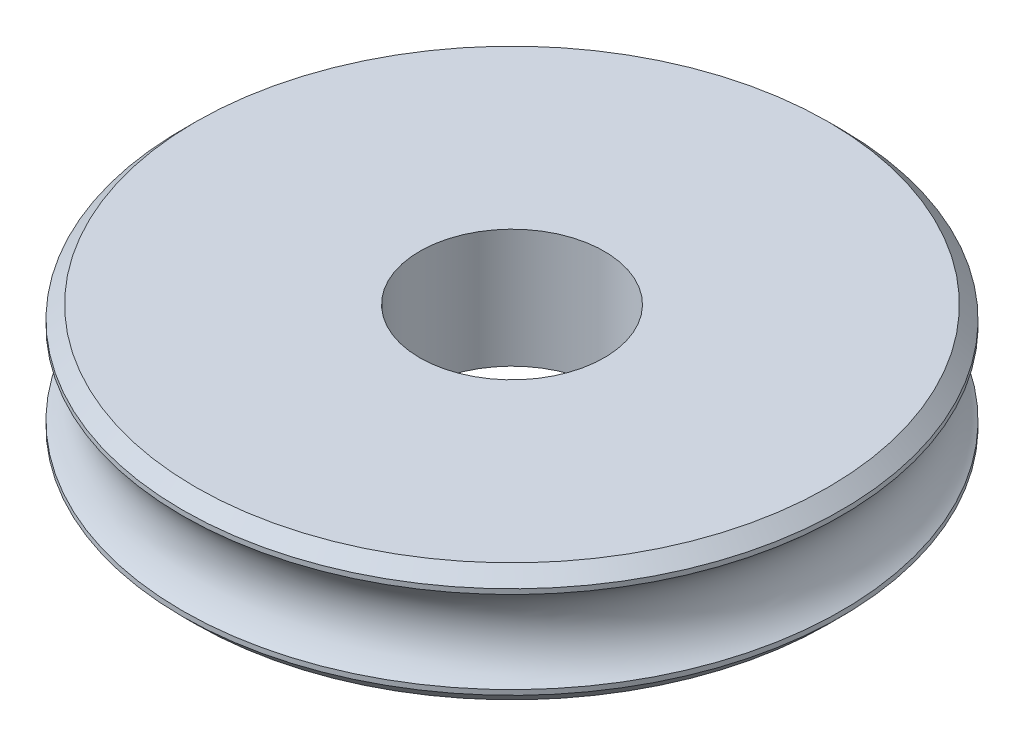
ISO-10303-21;
HEADER;
FILE_DESCRIPTION(('STEP AP214'),'2;1');
FILE_NAME('part.step','',(''),(''),'','','');
FILE_SCHEMA(('AUTOMOTIVE_DESIGN { 1 0 10303 214 1 1 1 1 }'));
ENDSEC;
DATA;
#1=APPLICATION_CONTEXT('core data for automotive mechanical design processes');
#2=APPLICATION_PROTOCOL_DEFINITION('international standard','automotive_design',2000,#1);
#3=PRODUCT_CONTEXT('',#1,'mechanical');
#4=PRODUCT('Part','Part','',(#3));
#5=PRODUCT_RELATED_PRODUCT_CATEGORY('part','',(#4));
#6=PRODUCT_DEFINITION_FORMATION('','',#4);
#7=PRODUCT_DEFINITION_CONTEXT('part definition',#1,'design');
#8=PRODUCT_DEFINITION('design','',#6,#7);
#9=PRODUCT_DEFINITION_SHAPE('','',#8);
#10=(LENGTH_UNIT() NAMED_UNIT(*) SI_UNIT(.MILLI.,.METRE.));
#11=(NAMED_UNIT(*) PLANE_ANGLE_UNIT() SI_UNIT($,.RADIAN.));
#12=(NAMED_UNIT(*) SI_UNIT($,.STERADIAN.) SOLID_ANGLE_UNIT());
#13=UNCERTAINTY_MEASURE_WITH_UNIT(LENGTH_MEASURE(1.E-05),#10,'distance_accuracy_value','');
#14=(GEOMETRIC_REPRESENTATION_CONTEXT(3) GLOBAL_UNCERTAINTY_ASSIGNED_CONTEXT((#13)) GLOBAL_UNIT_ASSIGNED_CONTEXT((#10,
#11,#12)) REPRESENTATION_CONTEXT('',''));
#15=CARTESIAN_POINT('',(0.,0.,0.));
#16=DIRECTION('',(0.,0.,1.));
#17=DIRECTION('',(1.,0.,0.));
#18=AXIS2_PLACEMENT_3D('',#15,#16,#17);
#19=CARTESIAN_POINT('',(0.,0.,0.));
#20=DIRECTION('',(0.,1.,0.));
#21=DIRECTION('',(0.,0.,1.));
#22=AXIS2_PLACEMENT_3D('',#19,#20,#21);
#23=TOROIDAL_SURFACE('',#22,13.75,2.);
#24=CARTESIAN_POINT('',(0.,1.5612494995996,0.));
#25=DIRECTION('',(0.,1.,0.));
#26=DIRECTION('',(0.,0.,1.));
#27=AXIS2_PLACEMENT_3D('',#24,#25,#26);
#28=CIRCLE('',#27,12.5);
#29=CARTESIAN_POINT('',(0.,1.5612494995996,12.5));
#30=VERTEX_POINT('',#29);
#31=EDGE_CURVE('E10',#30,#30,#28,.T.);
#32=ORIENTED_EDGE('',*,*,#31,.F.);
#33=EDGE_LOOP('',(#32));
#34=FACE_BOUND('',#33,.T.);
#35=CARTESIAN_POINT('',(0.,-1.5612494995996,0.));
#36=DIRECTION('',(0.,1.,0.));
#37=DIRECTION('',(0.,0.,1.));
#38=AXIS2_PLACEMENT_3D('',#35,#36,#37);
#39=CIRCLE('',#38,12.5);
#40=CARTESIAN_POINT('',(0.,-1.5612494995996,12.5));
#41=VERTEX_POINT('',#40);
#42=EDGE_CURVE('E69',#41,#41,#39,.T.);
#43=ORIENTED_EDGE('',*,*,#42,.T.);
#44=EDGE_LOOP('',(#43));
#45=FACE_BOUND('',#44,.T.);
#46=ADVANCED_FACE('F41',(#34,#45),#23,.F.);
#47=CARTESIAN_POINT('',(0.,0.,0.));
#48=DIRECTION('',(0.,1.,0.));
#49=DIRECTION('',(0.,0.,1.));
#50=AXIS2_PLACEMENT_3D('',#47,#48,#49);
#51=CYLINDRICAL_SURFACE('',#50,12.5);
#52=CARTESIAN_POINT('',(0.,1.75,0.));
#53=DIRECTION('',(0.,1.,0.));
#54=DIRECTION('',(0.,0.,1.));
#55=AXIS2_PLACEMENT_3D('',#52,#53,#54);
#56=CIRCLE('',#55,12.5);
#57=CARTESIAN_POINT('',(0.,1.75,12.5));
#58=VERTEX_POINT('',#57);
#59=EDGE_CURVE('E47',#58,#58,#56,.T.);
#60=ORIENTED_EDGE('',*,*,#59,.F.);
#61=EDGE_LOOP('',(#60));
#62=FACE_BOUND('',#61,.T.);
#63=ORIENTED_EDGE('',*,*,#31,.T.);
#64=EDGE_LOOP('',(#63));
#65=FACE_BOUND('',#64,.T.);
#66=ADVANCED_FACE('F106',(#62,#65),#51,.T.);
#67=CARTESIAN_POINT('',(0.,1.75,0.));
#68=DIRECTION('',(0.,-1.,0.));
#69=DIRECTION('',(0.,0.,-1.));
#70=AXIS2_PLACEMENT_3D('',#67,#68,#69);
#71=CONICAL_SURFACE('',#70,12.5,0.785398163397449);
#72=CARTESIAN_POINT('',(0.,2.25,0.));
#73=DIRECTION('',(0.,1.,0.));
#74=DIRECTION('',(0.,0.,1.));
#75=AXIS2_PLACEMENT_3D('',#72,#73,#74);
#76=CIRCLE('',#75,12.);
#77=CARTESIAN_POINT('',(0.,2.25,12.));
#78=VERTEX_POINT('',#77);
#79=EDGE_CURVE('E51',#78,#78,#76,.T.);
#80=ORIENTED_EDGE('',*,*,#79,.F.);
#81=EDGE_LOOP('',(#80));
#82=FACE_BOUND('',#81,.T.);
#83=ORIENTED_EDGE('',*,*,#59,.T.);
#84=EDGE_LOOP('',(#83));
#85=FACE_BOUND('',#84,.T.);
#86=ADVANCED_FACE('F101',(#82,#85),#71,.T.);
#87=CARTESIAN_POINT('',(3.5,2.25,0.));
#88=DIRECTION('',(0.,-1.,0.));
#89=DIRECTION('',(0.,0.,-1.));
#90=AXIS2_PLACEMENT_3D('',#87,#88,#89);
#91=PLANE('',#90);
#92=CARTESIAN_POINT('',(0.,2.25,0.));
#93=DIRECTION('',(0.,1.,0.));
#94=DIRECTION('',(0.,0.,1.));
#95=AXIS2_PLACEMENT_3D('',#92,#93,#94);
#96=CIRCLE('',#95,3.5);
#97=CARTESIAN_POINT('',(0.,2.25,3.5));
#98=VERTEX_POINT('',#97);
#99=EDGE_CURVE('E55',#98,#98,#96,.T.);
#100=ORIENTED_EDGE('',*,*,#99,.F.);
#101=EDGE_LOOP('',(#100));
#102=FACE_BOUND('',#101,.T.);
#103=ORIENTED_EDGE('',*,*,#79,.T.);
#104=EDGE_LOOP('',(#103));
#105=FACE_BOUND('',#104,.T.);
#106=ADVANCED_FACE('F95',(#102,#105),#91,.F.);
#107=CARTESIAN_POINT('',(0.,0.,0.));
#108=DIRECTION('',(0.,1.,0.));
#109=DIRECTION('',(0.,0.,1.));
#110=AXIS2_PLACEMENT_3D('',#107,#108,#109);
#111=CYLINDRICAL_SURFACE('',#110,3.5);
#112=CARTESIAN_POINT('',(0.,-2.25,0.));
#113=DIRECTION('',(0.,1.,0.));
#114=DIRECTION('',(0.,0.,1.));
#115=AXIS2_PLACEMENT_3D('',#112,#113,#114);
#116=CIRCLE('',#115,3.5);
#117=CARTESIAN_POINT('',(0.,-2.25,3.5));
#118=VERTEX_POINT('',#117);
#119=EDGE_CURVE('E60',#118,#118,#116,.T.);
#120=ORIENTED_EDGE('',*,*,#119,.F.);
#121=EDGE_LOOP('',(#120));
#122=FACE_BOUND('',#121,.T.);
#123=ORIENTED_EDGE('',*,*,#99,.T.);
#124=EDGE_LOOP('',(#123));
#125=FACE_BOUND('',#124,.T.);
#126=ADVANCED_FACE('F89',(#122,#125),#111,.F.);
#127=CARTESIAN_POINT('',(3.5,-2.25,0.));
#128=DIRECTION('',(0.,1.,0.));
#129=DIRECTION('',(0.,0.,1.));
#130=AXIS2_PLACEMENT_3D('',#127,#128,#129);
#131=PLANE('',#130);
#132=CARTESIAN_POINT('',(0.,-2.25,0.));
#133=DIRECTION('',(0.,1.,0.));
#134=DIRECTION('',(0.,0.,1.));
#135=AXIS2_PLACEMENT_3D('',#132,#133,#134);
#136=CIRCLE('',#135,12.);
#137=CARTESIAN_POINT('',(0.,-2.25,12.));
#138=VERTEX_POINT('',#137);
#139=EDGE_CURVE('E63',#138,#138,#136,.T.);
#140=ORIENTED_EDGE('',*,*,#139,.F.);
#141=EDGE_LOOP('',(#140));
#142=FACE_BOUND('',#141,.T.);
#143=ORIENTED_EDGE('',*,*,#119,.T.);
#144=EDGE_LOOP('',(#143));
#145=FACE_BOUND('',#144,.T.);
#146=ADVANCED_FACE('F83',(#142,#145),#131,.F.);
#147=CARTESIAN_POINT('',(0.,-2.25,0.));
#148=DIRECTION('',(0.,1.,0.));
#149=DIRECTION('',(0.,0.,1.));
#150=AXIS2_PLACEMENT_3D('',#147,#148,#149);
#151=CONICAL_SURFACE('',#150,12.,0.785398163397449);
#152=CARTESIAN_POINT('',(0.,-1.75,0.));
#153=DIRECTION('',(0.,1.,0.));
#154=DIRECTION('',(0.,0.,1.));
#155=AXIS2_PLACEMENT_3D('',#152,#153,#154);
#156=CIRCLE('',#155,12.5);
#157=CARTESIAN_POINT('',(0.,-1.75,12.5));
#158=VERTEX_POINT('',#157);
#159=EDGE_CURVE('E66',#158,#158,#156,.T.);
#160=ORIENTED_EDGE('',*,*,#159,.F.);
#161=EDGE_LOOP('',(#160));
#162=FACE_BOUND('',#161,.T.);
#163=ORIENTED_EDGE('',*,*,#139,.T.);
#164=EDGE_LOOP('',(#163));
#165=FACE_BOUND('',#164,.T.);
#166=ADVANCED_FACE('F77',(#162,#165),#151,.T.);
#167=CARTESIAN_POINT('',(0.,0.,0.));
#168=DIRECTION('',(0.,1.,0.));
#169=DIRECTION('',(0.,0.,1.));
#170=AXIS2_PLACEMENT_3D('',#167,#168,#169);
#171=CYLINDRICAL_SURFACE('',#170,12.5);
#172=ORIENTED_EDGE('',*,*,#42,.F.);
#173=EDGE_LOOP('',(#172));
#174=FACE_BOUND('',#173,.T.);
#175=ORIENTED_EDGE('',*,*,#159,.T.);
#176=EDGE_LOOP('',(#175));
#177=FACE_BOUND('',#176,.T.);
#178=ADVANCED_FACE('F74',(#174,#177),#171,.T.);
#179=CLOSED_SHELL('',(#46,#66,#86,#106,#126,#146,#166,#178));
#180=MANIFOLD_SOLID_BREP('B2',#179);
#181=ADVANCED_BREP_SHAPE_REPRESENTATION('',(#18,#180),#14);
#182=SHAPE_DEFINITION_REPRESENTATION(#9,#181);
ENDSEC;
END-ISO-10303-21;
